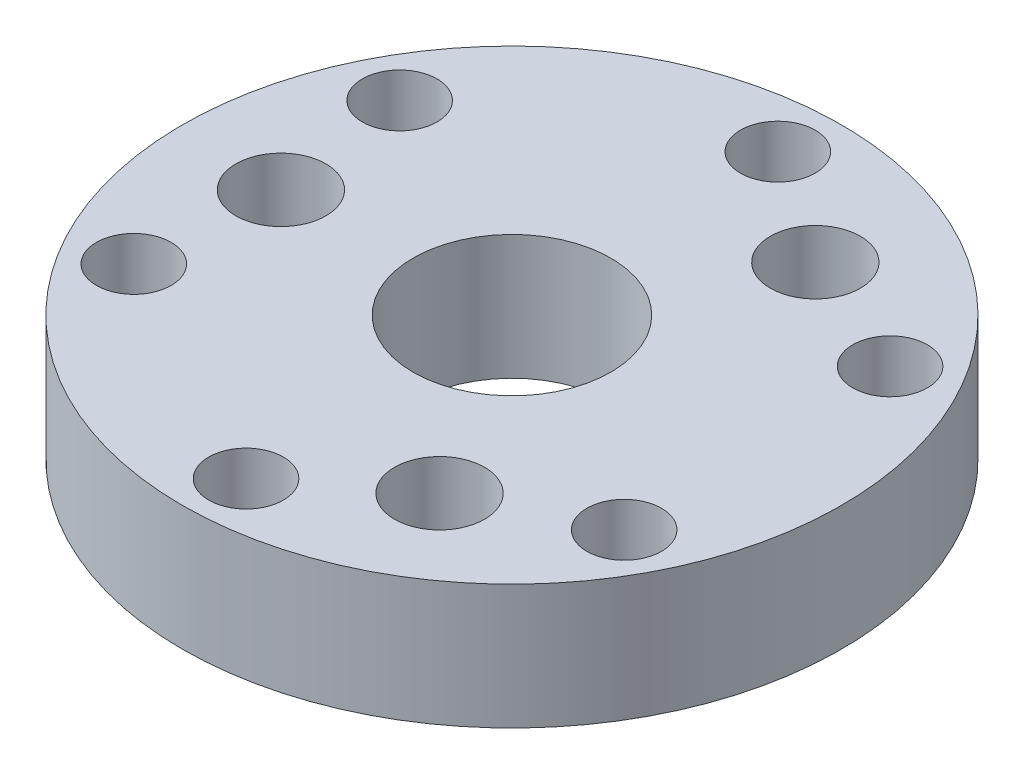
ISO-10303-21;
HEADER;
FILE_DESCRIPTION(('STEP AP214'),'2;1');
FILE_NAME('part.step','',(''),(''),'','','');
FILE_SCHEMA(('AUTOMOTIVE_DESIGN { 1 0 10303 214 1 1 1 1 }'));
ENDSEC;
DATA;
#1=APPLICATION_CONTEXT('core data for automotive mechanical design processes');
#2=APPLICATION_PROTOCOL_DEFINITION('international standard','automotive_design',2000,#1);
#3=PRODUCT_CONTEXT('',#1,'mechanical');
#4=PRODUCT('Part','Part','',(#3));
#5=PRODUCT_RELATED_PRODUCT_CATEGORY('part','',(#4));
#6=PRODUCT_DEFINITION_FORMATION('','',#4);
#7=PRODUCT_DEFINITION_CONTEXT('part definition',#1,'design');
#8=PRODUCT_DEFINITION('design','',#6,#7);
#9=PRODUCT_DEFINITION_SHAPE('','',#8);
#10=(LENGTH_UNIT() NAMED_UNIT(*) SI_UNIT(.MILLI.,.METRE.));
#11=(NAMED_UNIT(*) PLANE_ANGLE_UNIT() SI_UNIT($,.RADIAN.));
#12=(NAMED_UNIT(*) SI_UNIT($,.STERADIAN.) SOLID_ANGLE_UNIT());
#13=UNCERTAINTY_MEASURE_WITH_UNIT(LENGTH_MEASURE(1.E-05),#10,'distance_accuracy_value','');
#14=(GEOMETRIC_REPRESENTATION_CONTEXT(3) GLOBAL_UNCERTAINTY_ASSIGNED_CONTEXT((#13)) GLOBAL_UNIT_ASSIGNED_CONTEXT((#10,
#11,#12)) REPRESENTATION_CONTEXT('',''));
#15=CARTESIAN_POINT('',(0.,0.,0.));
#16=DIRECTION('',(0.,0.,1.));
#17=DIRECTION('',(1.,0.,0.));
#18=AXIS2_PLACEMENT_3D('',#15,#16,#17);
#19=CARTESIAN_POINT('',(152.4,8.845,171.45));
#20=DIRECTION('',(0.,-1.,0.));
#21=DIRECTION('',(0.,0.,-1.));
#22=AXIS2_PLACEMENT_3D('',#19,#20,#21);
#23=CYLINDRICAL_SURFACE('',#22,15.);
#24=CARTESIAN_POINT('',(152.4,8.845,171.45));
#25=DIRECTION('',(0.,1.,0.));
#26=DIRECTION('',(0.,0.,1.));
#27=AXIS2_PLACEMENT_3D('',#24,#25,#26);
#28=CIRCLE('',#27,15.);
#29=CARTESIAN_POINT('',(152.4,8.845,186.45));
#30=VERTEX_POINT('',#29);
#31=EDGE_CURVE('E10',#30,#30,#28,.T.);
#32=ORIENTED_EDGE('',*,*,#31,.F.);
#33=EDGE_LOOP('',(#32));
#34=FACE_BOUND('',#33,.T.);
#35=CARTESIAN_POINT('',(152.4,3.175,171.45));
#36=DIRECTION('',(0.,1.,0.));
#37=DIRECTION('',(0.,0.,1.));
#38=AXIS2_PLACEMENT_3D('',#35,#36,#37);
#39=CIRCLE('',#38,15.);
#40=CARTESIAN_POINT('',(152.4,3.175,186.45));
#41=VERTEX_POINT('',#40);
#42=EDGE_CURVE('E46',#41,#41,#39,.T.);
#43=ORIENTED_EDGE('',*,*,#42,.T.);
#44=EDGE_LOOP('',(#43));
#45=FACE_BOUND('',#44,.T.);
#46=ADVANCED_FACE('F43',(#34,#45),#23,.T.);
#47=CARTESIAN_POINT('',(152.4,8.845,171.45));
#48=DIRECTION('',(0.,1.,0.));
#49=DIRECTION('',(0.,0.,1.));
#50=AXIS2_PLACEMENT_3D('',#47,#48,#49);
#51=PLANE('',#50);
#52=CARTESIAN_POINT('',(163.023658662336,8.845,164.863052556292));
#53=DIRECTION('',(0.,1.,0.));
#54=DIRECTION('',(0.,0.,1.));
#55=AXIS2_PLACEMENT_3D('',#52,#53,#54);
#56=CIRCLE('',#55,1.70000000000001);
#57=CARTESIAN_POINT('',(163.023658662336,8.845,166.563052556292));
#58=VERTEX_POINT('',#57);
#59=EDGE_CURVE('E106',#58,#58,#56,.T.);
#60=ORIENTED_EDGE('',*,*,#59,.F.);
#61=EDGE_LOOP('',(#60));
#62=FACE_BOUND('',#61,.T.);
#63=CARTESIAN_POINT('',(157.774949114066,8.845,180.118905468466));
#64=DIRECTION('',(0.,1.,0.));
#65=DIRECTION('',(0.,0.,1.));
#66=AXIS2_PLACEMENT_3D('',#63,#64,#65);
#67=CIRCLE('',#66,2.05);
#68=CARTESIAN_POINT('',(157.774949114066,8.845,182.168905468466));
#69=VERTEX_POINT('',#68);
#70=EDGE_CURVE('E97',#69,#69,#67,.T.);
#71=ORIENTED_EDGE('',*,*,#70,.F.);
#72=EDGE_LOOP('',(#71));
#73=FACE_BOUND('',#72,.T.);
#74=CARTESIAN_POINT('',(142.20503308427,8.845,171.770389742597));
#75=DIRECTION('',(0.,1.,0.));
#76=DIRECTION('',(0.,0.,1.));
#77=AXIS2_PLACEMENT_3D('',#74,#75,#76);
#78=CIRCLE('',#77,2.05);
#79=CARTESIAN_POINT('',(142.20503308427,8.845,173.820389742597));
#80=VERTEX_POINT('',#79);
#81=EDGE_CURVE('E125',#80,#80,#78,.T.);
#82=ORIENTED_EDGE('',*,*,#81,.F.);
#83=EDGE_LOOP('',(#82));
#84=FACE_BOUND('',#83,.T.);
#85=CARTESIAN_POINT('',(157.220017801664,8.845,162.460704788937));
#86=DIRECTION('',(0.,1.,0.));
#87=DIRECTION('',(0.,0.,1.));
#88=AXIS2_PLACEMENT_3D('',#85,#86,#87);
#89=CIRCLE('',#88,2.05);
#90=CARTESIAN_POINT('',(157.220017801664,8.845,164.510704788937));
#91=VERTEX_POINT('',#90);
#92=EDGE_CURVE('E113',#91,#91,#89,.T.);
#93=ORIENTED_EDGE('',*,*,#92,.F.);
#94=EDGE_LOOP('',(#93));
#95=FACE_BOUND('',#94,.T.);
#96=CARTESIAN_POINT('',(152.007365511523,8.845,158.956167995428));
#97=DIRECTION('',(0.,1.,0.));
#98=DIRECTION('',(0.,0.,1.));
#99=AXIS2_PLACEMENT_3D('',#96,#97,#98);
#100=CIRCLE('',#99,1.70000000000001);
#101=CARTESIAN_POINT('',(152.007365511523,8.845,160.656167995428));
#102=VERTEX_POINT('',#101);
#103=EDGE_CURVE('E63',#102,#102,#100,.T.);
#104=ORIENTED_EDGE('',*,*,#103,.F.);
#105=EDGE_LOOP('',(#104));
#106=FACE_BOUND('',#105,.T.);
#107=CARTESIAN_POINT('',(141.383706849188,8.845,165.543115439137));
#108=DIRECTION('',(0.,1.,0.));
#109=DIRECTION('',(0.,0.,1.));
#110=AXIS2_PLACEMENT_3D('',#107,#108,#109);
#111=CIRCLE('',#110,1.70000000000001);
#112=CARTESIAN_POINT('',(141.383706849188,8.845,167.243115439137));
#113=VERTEX_POINT('',#112);
#114=EDGE_CURVE('E72',#113,#113,#111,.T.);
#115=ORIENTED_EDGE('',*,*,#114,.F.);
#116=EDGE_LOOP('',(#115));
#117=FACE_BOUND('',#116,.T.);
#118=CARTESIAN_POINT('',(141.776341337664,8.845,178.036947443708));
#119=DIRECTION('',(0.,1.,0.));
#120=DIRECTION('',(0.,0.,1.));
#121=AXIS2_PLACEMENT_3D('',#118,#119,#120);
#122=CIRCLE('',#121,1.70000000000001);
#123=CARTESIAN_POINT('',(141.776341337664,8.845,179.736947443708));
#124=VERTEX_POINT('',#123);
#125=EDGE_CURVE('E85',#124,#124,#122,.T.);
#126=ORIENTED_EDGE('',*,*,#125,.F.);
#127=EDGE_LOOP('',(#126));
#128=FACE_BOUND('',#127,.T.);
#129=CARTESIAN_POINT('',(152.792634488477,8.845,183.943832004572));
#130=DIRECTION('',(0.,1.,0.));
#131=DIRECTION('',(0.,0.,1.));
#132=AXIS2_PLACEMENT_3D('',#129,#130,#131);
#133=CIRCLE('',#132,1.70000000000001);
#134=CARTESIAN_POINT('',(152.792634488477,8.845,185.643832004572));
#135=VERTEX_POINT('',#134);
#136=EDGE_CURVE('E89',#135,#135,#133,.T.);
#137=ORIENTED_EDGE('',*,*,#136,.F.);
#138=EDGE_LOOP('',(#137));
#139=FACE_BOUND('',#138,.T.);
#140=CARTESIAN_POINT('',(152.4,8.845,171.45));
#141=DIRECTION('',(0.,1.,0.));
#142=DIRECTION('',(0.,0.,1.));
#143=AXIS2_PLACEMENT_3D('',#140,#141,#142);
#144=CIRCLE('',#143,4.5);
#145=CARTESIAN_POINT('',(152.4,8.845,175.95));
#146=VERTEX_POINT('',#145);
#147=EDGE_CURVE('E126',#146,#146,#144,.T.);
#148=ORIENTED_EDGE('',*,*,#147,.F.);
#149=EDGE_LOOP('',(#148));
#150=FACE_BOUND('',#149,.T.);
#151=CARTESIAN_POINT('',(163.416293150812,8.845,177.356884560863));
#152=DIRECTION('',(0.,1.,0.));
#153=DIRECTION('',(0.,0.,1.));
#154=AXIS2_PLACEMENT_3D('',#151,#152,#153);
#155=CIRCLE('',#154,1.70000000000001);
#156=CARTESIAN_POINT('',(163.416293150812,8.845,179.056884560863));
#157=VERTEX_POINT('',#156);
#158=EDGE_CURVE('E54',#157,#157,#155,.T.);
#159=ORIENTED_EDGE('',*,*,#158,.F.);
#160=EDGE_LOOP('',(#159));
#161=FACE_BOUND('',#160,.T.);
#162=ORIENTED_EDGE('',*,*,#31,.T.);
#163=EDGE_LOOP('',(#162));
#164=FACE_BOUND('',#163,.T.);
#165=ADVANCED_FACE('F160',(#62,#73,#84,#95,#106,#117,#128,#139,#150,#161,#164),#51,.T.);
#166=CARTESIAN_POINT('',(152.4,3.175,171.45));
#167=DIRECTION('',(0.,1.,0.));
#168=DIRECTION('',(0.,0.,1.));
#169=AXIS2_PLACEMENT_3D('',#166,#167,#168);
#170=PLANE('',#169);
#171=CARTESIAN_POINT('',(163.023658662336,3.175,164.863052556292));
#172=DIRECTION('',(0.,1.,0.));
#173=DIRECTION('',(0.,0.,1.));
#174=AXIS2_PLACEMENT_3D('',#171,#172,#173);
#175=CIRCLE('',#174,1.70000000000001);
#176=CARTESIAN_POINT('',(163.023658662336,3.175,166.563052556292));
#177=VERTEX_POINT('',#176);
#178=EDGE_CURVE('E69',#177,#177,#175,.T.);
#179=ORIENTED_EDGE('',*,*,#178,.T.);
#180=EDGE_LOOP('',(#179));
#181=FACE_BOUND('',#180,.T.);
#182=CARTESIAN_POINT('',(157.774949114066,3.175,180.118905468466));
#183=DIRECTION('',(0.,1.,0.));
#184=DIRECTION('',(0.,0.,1.));
#185=AXIS2_PLACEMENT_3D('',#182,#183,#184);
#186=CIRCLE('',#185,2.05);
#187=CARTESIAN_POINT('',(157.774949114066,3.175,182.168905468466));
#188=VERTEX_POINT('',#187);
#189=EDGE_CURVE('E103',#188,#188,#186,.T.);
#190=ORIENTED_EDGE('',*,*,#189,.T.);
#191=EDGE_LOOP('',(#190));
#192=FACE_BOUND('',#191,.T.);
#193=CARTESIAN_POINT('',(142.20503308427,3.175,171.770389742597));
#194=DIRECTION('',(0.,1.,0.));
#195=DIRECTION('',(0.,0.,1.));
#196=AXIS2_PLACEMENT_3D('',#193,#194,#195);
#197=CIRCLE('',#196,2.05);
#198=CARTESIAN_POINT('',(142.20503308427,3.175,173.820389742597));
#199=VERTEX_POINT('',#198);
#200=EDGE_CURVE('E105',#199,#199,#197,.T.);
#201=ORIENTED_EDGE('',*,*,#200,.T.);
#202=EDGE_LOOP('',(#201));
#203=FACE_BOUND('',#202,.T.);
#204=CARTESIAN_POINT('',(157.220017801664,3.175,162.460704788937));
#205=DIRECTION('',(0.,1.,0.));
#206=DIRECTION('',(0.,0.,1.));
#207=AXIS2_PLACEMENT_3D('',#204,#205,#206);
#208=CIRCLE('',#207,2.05);
#209=CARTESIAN_POINT('',(157.220017801664,3.175,164.510704788937));
#210=VERTEX_POINT('',#209);
#211=EDGE_CURVE('E120',#210,#210,#208,.T.);
#212=ORIENTED_EDGE('',*,*,#211,.T.);
#213=EDGE_LOOP('',(#212));
#214=FACE_BOUND('',#213,.T.);
#215=CARTESIAN_POINT('',(152.007365511523,3.175,158.956167995428));
#216=DIRECTION('',(0.,1.,0.));
#217=DIRECTION('',(0.,0.,1.));
#218=AXIS2_PLACEMENT_3D('',#215,#216,#217);
#219=CIRCLE('',#218,1.70000000000001);
#220=CARTESIAN_POINT('',(152.007365511523,3.175,160.656167995428));
#221=VERTEX_POINT('',#220);
#222=EDGE_CURVE('E67',#221,#221,#219,.T.);
#223=ORIENTED_EDGE('',*,*,#222,.T.);
#224=EDGE_LOOP('',(#223));
#225=FACE_BOUND('',#224,.T.);
#226=CARTESIAN_POINT('',(141.383706849188,3.175,165.543115439137));
#227=DIRECTION('',(0.,1.,0.));
#228=DIRECTION('',(0.,0.,1.));
#229=AXIS2_PLACEMENT_3D('',#226,#227,#228);
#230=CIRCLE('',#229,1.70000000000001);
#231=CARTESIAN_POINT('',(141.383706849188,3.175,167.243115439137));
#232=VERTEX_POINT('',#231);
#233=EDGE_CURVE('E76',#232,#232,#230,.T.);
#234=ORIENTED_EDGE('',*,*,#233,.T.);
#235=EDGE_LOOP('',(#234));
#236=FACE_BOUND('',#235,.T.);
#237=CARTESIAN_POINT('',(141.776341337664,3.175,178.036947443708));
#238=DIRECTION('',(0.,1.,0.));
#239=DIRECTION('',(0.,0.,1.));
#240=AXIS2_PLACEMENT_3D('',#237,#238,#239);
#241=CIRCLE('',#240,1.70000000000001);
#242=CARTESIAN_POINT('',(141.776341337664,3.175,179.736947443708));
#243=VERTEX_POINT('',#242);
#244=EDGE_CURVE('E86',#243,#243,#241,.T.);
#245=ORIENTED_EDGE('',*,*,#244,.T.);
#246=EDGE_LOOP('',(#245));
#247=FACE_BOUND('',#246,.T.);
#248=CARTESIAN_POINT('',(152.792634488477,3.175,183.943832004572));
#249=DIRECTION('',(0.,1.,0.));
#250=DIRECTION('',(0.,0.,1.));
#251=AXIS2_PLACEMENT_3D('',#248,#249,#250);
#252=CIRCLE('',#251,1.70000000000001);
#253=CARTESIAN_POINT('',(152.792634488477,3.175,185.643832004572));
#254=VERTEX_POINT('',#253);
#255=EDGE_CURVE('E62',#254,#254,#252,.T.);
#256=ORIENTED_EDGE('',*,*,#255,.T.);
#257=EDGE_LOOP('',(#256));
#258=FACE_BOUND('',#257,.T.);
#259=CARTESIAN_POINT('',(152.4,3.175,171.45));
#260=DIRECTION('',(0.,1.,0.));
#261=DIRECTION('',(0.,0.,1.));
#262=AXIS2_PLACEMENT_3D('',#259,#260,#261);
#263=CIRCLE('',#262,4.5);
#264=CARTESIAN_POINT('',(152.4,3.175,175.95));
#265=VERTEX_POINT('',#264);
#266=EDGE_CURVE('E117',#265,#265,#263,.T.);
#267=ORIENTED_EDGE('',*,*,#266,.T.);
#268=EDGE_LOOP('',(#267));
#269=FACE_BOUND('',#268,.T.);
#270=CARTESIAN_POINT('',(163.416293150812,3.175,177.356884560863));
#271=DIRECTION('',(0.,1.,0.));
#272=DIRECTION('',(0.,0.,1.));
#273=AXIS2_PLACEMENT_3D('',#270,#271,#272);
#274=CIRCLE('',#273,1.70000000000001);
#275=CARTESIAN_POINT('',(163.416293150812,3.175,179.056884560863));
#276=VERTEX_POINT('',#275);
#277=EDGE_CURVE('E60',#276,#276,#274,.T.);
#278=ORIENTED_EDGE('',*,*,#277,.T.);
#279=EDGE_LOOP('',(#278));
#280=FACE_BOUND('',#279,.T.);
#281=ORIENTED_EDGE('',*,*,#42,.F.);
#282=EDGE_LOOP('',(#281));
#283=FACE_BOUND('',#282,.T.);
#284=ADVANCED_FACE('F140',(#181,#192,#203,#214,#225,#236,#247,#258,#269,#280,#283),#170,.F.);
#285=CARTESIAN_POINT('',(163.416293150812,8.845,177.356884560863));
#286=DIRECTION('',(0.,-1.,0.));
#287=DIRECTION('',(0.,0.,-1.));
#288=AXIS2_PLACEMENT_3D('',#285,#286,#287);
#289=CYLINDRICAL_SURFACE('',#288,1.70000000000001);
#290=ORIENTED_EDGE('',*,*,#158,.T.);
#291=EDGE_LOOP('',(#290));
#292=FACE_BOUND('',#291,.T.);
#293=ORIENTED_EDGE('',*,*,#277,.F.);
#294=EDGE_LOOP('',(#293));
#295=FACE_BOUND('',#294,.T.);
#296=ADVANCED_FACE('F141',(#292,#295),#289,.F.);
#297=CARTESIAN_POINT('',(152.4,8.845,171.45));
#298=DIRECTION('',(0.,-1.,0.));
#299=DIRECTION('',(0.,0.,-1.));
#300=AXIS2_PLACEMENT_3D('',#297,#298,#299);
#301=CYLINDRICAL_SURFACE('',#300,4.5);
#302=ORIENTED_EDGE('',*,*,#147,.T.);
#303=EDGE_LOOP('',(#302));
#304=FACE_BOUND('',#303,.T.);
#305=ORIENTED_EDGE('',*,*,#266,.F.);
#306=EDGE_LOOP('',(#305));
#307=FACE_BOUND('',#306,.T.);
#308=ADVANCED_FACE('F139',(#304,#307),#301,.F.);
#309=CARTESIAN_POINT('',(152.792634488477,8.845,183.943832004572));
#310=DIRECTION('',(0.,-1.,0.));
#311=DIRECTION('',(0.,0.,-1.));
#312=AXIS2_PLACEMENT_3D('',#309,#310,#311);
#313=CYLINDRICAL_SURFACE('',#312,1.70000000000001);
#314=ORIENTED_EDGE('',*,*,#136,.T.);
#315=EDGE_LOOP('',(#314));
#316=FACE_BOUND('',#315,.T.);
#317=ORIENTED_EDGE('',*,*,#255,.F.);
#318=EDGE_LOOP('',(#317));
#319=FACE_BOUND('',#318,.T.);
#320=ADVANCED_FACE('F145',(#316,#319),#313,.F.);
#321=CARTESIAN_POINT('',(141.776341337664,8.845,178.036947443708));
#322=DIRECTION('',(0.,-1.,0.));
#323=DIRECTION('',(0.,0.,-1.));
#324=AXIS2_PLACEMENT_3D('',#321,#322,#323);
#325=CYLINDRICAL_SURFACE('',#324,1.70000000000001);
#326=ORIENTED_EDGE('',*,*,#125,.T.);
#327=EDGE_LOOP('',(#326));
#328=FACE_BOUND('',#327,.T.);
#329=ORIENTED_EDGE('',*,*,#244,.F.);
#330=EDGE_LOOP('',(#329));
#331=FACE_BOUND('',#330,.T.);
#332=ADVANCED_FACE('F148',(#328,#331),#325,.F.);
#333=CARTESIAN_POINT('',(141.383706849188,8.845,165.543115439137));
#334=DIRECTION('',(0.,-1.,0.));
#335=DIRECTION('',(0.,0.,-1.));
#336=AXIS2_PLACEMENT_3D('',#333,#334,#335);
#337=CYLINDRICAL_SURFACE('',#336,1.70000000000001);
#338=ORIENTED_EDGE('',*,*,#114,.T.);
#339=EDGE_LOOP('',(#338));
#340=FACE_BOUND('',#339,.T.);
#341=ORIENTED_EDGE('',*,*,#233,.F.);
#342=EDGE_LOOP('',(#341));
#343=FACE_BOUND('',#342,.T.);
#344=ADVANCED_FACE('F180',(#340,#343),#337,.F.);
#345=CARTESIAN_POINT('',(152.007365511523,8.845,158.956167995428));
#346=DIRECTION('',(0.,-1.,0.));
#347=DIRECTION('',(0.,0.,-1.));
#348=AXIS2_PLACEMENT_3D('',#345,#346,#347);
#349=CYLINDRICAL_SURFACE('',#348,1.70000000000001);
#350=ORIENTED_EDGE('',*,*,#103,.T.);
#351=EDGE_LOOP('',(#350));
#352=FACE_BOUND('',#351,.T.);
#353=ORIENTED_EDGE('',*,*,#222,.F.);
#354=EDGE_LOOP('',(#353));
#355=FACE_BOUND('',#354,.T.);
#356=ADVANCED_FACE('F173',(#352,#355),#349,.F.);
#357=CARTESIAN_POINT('',(157.220017801664,8.845,162.460704788937));
#358=DIRECTION('',(0.,-1.,0.));
#359=DIRECTION('',(0.,0.,-1.));
#360=AXIS2_PLACEMENT_3D('',#357,#358,#359);
#361=CYLINDRICAL_SURFACE('',#360,2.05);
#362=ORIENTED_EDGE('',*,*,#92,.T.);
#363=EDGE_LOOP('',(#362));
#364=FACE_BOUND('',#363,.T.);
#365=ORIENTED_EDGE('',*,*,#211,.F.);
#366=EDGE_LOOP('',(#365));
#367=FACE_BOUND('',#366,.T.);
#368=ADVANCED_FACE('F176',(#364,#367),#361,.F.);
#369=CARTESIAN_POINT('',(142.20503308427,8.845,171.770389742597));
#370=DIRECTION('',(0.,-1.,0.));
#371=DIRECTION('',(0.,0.,-1.));
#372=AXIS2_PLACEMENT_3D('',#369,#370,#371);
#373=CYLINDRICAL_SURFACE('',#372,2.05);
#374=ORIENTED_EDGE('',*,*,#81,.T.);
#375=EDGE_LOOP('',(#374));
#376=FACE_BOUND('',#375,.T.);
#377=ORIENTED_EDGE('',*,*,#200,.F.);
#378=EDGE_LOOP('',(#377));
#379=FACE_BOUND('',#378,.T.);
#380=ADVANCED_FACE('F186',(#376,#379),#373,.F.);
#381=CARTESIAN_POINT('',(157.774949114066,8.845,180.118905468466));
#382=DIRECTION('',(0.,-1.,0.));
#383=DIRECTION('',(0.,0.,-1.));
#384=AXIS2_PLACEMENT_3D('',#381,#382,#383);
#385=CYLINDRICAL_SURFACE('',#384,2.05);
#386=ORIENTED_EDGE('',*,*,#70,.T.);
#387=EDGE_LOOP('',(#386));
#388=FACE_BOUND('',#387,.T.);
#389=ORIENTED_EDGE('',*,*,#189,.F.);
#390=EDGE_LOOP('',(#389));
#391=FACE_BOUND('',#390,.T.);
#392=ADVANCED_FACE('F184',(#388,#391),#385,.F.);
#393=CARTESIAN_POINT('',(163.023658662336,8.845,164.863052556292));
#394=DIRECTION('',(0.,-1.,0.));
#395=DIRECTION('',(0.,0.,-1.));
#396=AXIS2_PLACEMENT_3D('',#393,#394,#395);
#397=CYLINDRICAL_SURFACE('',#396,1.70000000000001);
#398=ORIENTED_EDGE('',*,*,#59,.T.);
#399=EDGE_LOOP('',(#398));
#400=FACE_BOUND('',#399,.T.);
#401=ORIENTED_EDGE('',*,*,#178,.F.);
#402=EDGE_LOOP('',(#401));
#403=FACE_BOUND('',#402,.T.);
#404=ADVANCED_FACE('F189',(#400,#403),#397,.F.);
#405=CLOSED_SHELL('',(#46,#165,#284,#296,#308,#320,#332,#344,#356,#368,#380,#392,#404));
#406=MANIFOLD_SOLID_BREP('B2',#405);
#407=ADVANCED_BREP_SHAPE_REPRESENTATION('',(#18,#406),#14);
#408=SHAPE_DEFINITION_REPRESENTATION(#9,#407);
ENDSEC;
END-ISO-10303-21;
